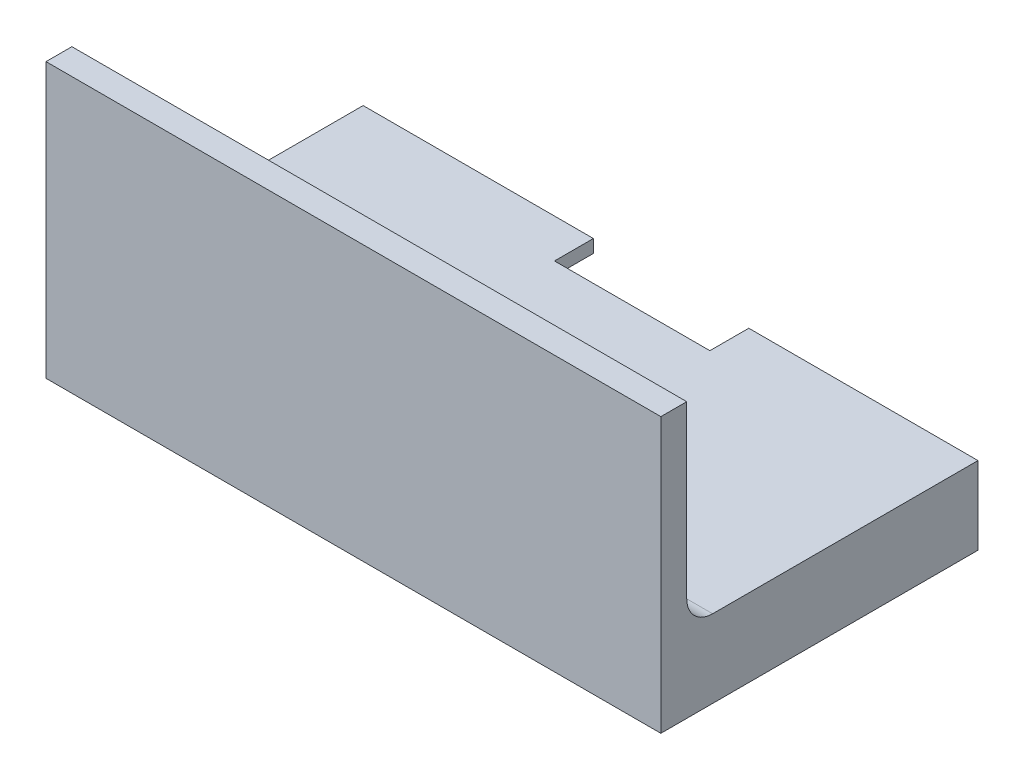
ISO-10303-21;
HEADER;
FILE_DESCRIPTION(('STEP AP214'),'2;1');
FILE_NAME('part.step','',(''),(''),'','','');
FILE_SCHEMA(('AUTOMOTIVE_DESIGN { 1 0 10303 214 1 1 1 1 }'));
ENDSEC;
DATA;
#1=APPLICATION_CONTEXT('core data for automotive mechanical design processes');
#2=APPLICATION_PROTOCOL_DEFINITION('international standard','automotive_design',2000,#1);
#3=PRODUCT_CONTEXT('',#1,'mechanical');
#4=PRODUCT('Part','Part','',(#3));
#5=PRODUCT_RELATED_PRODUCT_CATEGORY('part','',(#4));
#6=PRODUCT_DEFINITION_FORMATION('','',#4);
#7=PRODUCT_DEFINITION_CONTEXT('part definition',#1,'design');
#8=PRODUCT_DEFINITION('design','',#6,#7);
#9=PRODUCT_DEFINITION_SHAPE('','',#8);
#10=(LENGTH_UNIT() NAMED_UNIT(*) SI_UNIT(.MILLI.,.METRE.));
#11=(NAMED_UNIT(*) PLANE_ANGLE_UNIT() SI_UNIT($,.RADIAN.));
#12=(NAMED_UNIT(*) SI_UNIT($,.STERADIAN.) SOLID_ANGLE_UNIT());
#13=UNCERTAINTY_MEASURE_WITH_UNIT(LENGTH_MEASURE(1.E-05),#10,'distance_accuracy_value','');
#14=(GEOMETRIC_REPRESENTATION_CONTEXT(3) GLOBAL_UNCERTAINTY_ASSIGNED_CONTEXT((#13)) GLOBAL_UNIT_ASSIGNED_CONTEXT((#10,
#11,#12)) REPRESENTATION_CONTEXT('',''));
#15=CARTESIAN_POINT('',(0.,0.,0.));
#16=DIRECTION('',(0.,0.,1.));
#17=DIRECTION('',(1.,0.,0.));
#18=AXIS2_PLACEMENT_3D('',#15,#16,#17);
#19=CARTESIAN_POINT('',(-79.8619125241838,8.,13.7648006214418));
#20=DIRECTION('',(-1.,0.,0.));
#21=DIRECTION('',(0.,0.,1.));
#22=AXIS2_PLACEMENT_3D('',#19,#20,#21);
#23=CYLINDRICAL_SURFACE('',#22,2.);
#24=DIRECTION('',(-1.,0.,0.));
#25=VECTOR('',#24,1.);
#26=CARTESIAN_POINT('',(-79.8619125241838,8.,15.7648006214418));
#27=LINE('',#26,#25);
#28=CARTESIAN_POINT('',(-32.3619125241838,8.,15.7648006214418));
#29=VERTEX_POINT('',#28);
#30=CARTESIAN_POINT('',(-79.8619125241838,8.,15.7648006214418));
#31=VERTEX_POINT('',#30);
#32=EDGE_CURVE('E360',#29,#31,#27,.T.);
#33=ORIENTED_EDGE('',*,*,#32,.F.);
#34=CARTESIAN_POINT('',(-32.3619125241838,8.,13.7648006214418));
#35=DIRECTION('',(-1.,0.,0.));
#36=DIRECTION('',(0.,0.,1.));
#37=AXIS2_PLACEMENT_3D('',#34,#35,#36);
#38=CIRCLE('',#37,2.);
#39=CARTESIAN_POINT('',(-32.3619125241838,6.,13.7648006214417));
#40=VERTEX_POINT('',#39);
#41=EDGE_CURVE('E68',#29,#40,#38,.F.);
#42=ORIENTED_EDGE('',*,*,#41,.T.);
#43=DIRECTION('',(-1.,0.,0.));
#44=VECTOR('',#43,1.);
#45=CARTESIAN_POINT('',(0.,6.,13.7648006214418));
#46=LINE('',#45,#44);
#47=CARTESIAN_POINT('',(-79.8619125241838,6.,13.7648006214417));
#48=VERTEX_POINT('',#47);
#49=EDGE_CURVE('E364',#48,#40,#46,.F.);
#50=ORIENTED_EDGE('',*,*,#49,.F.);
#51=CARTESIAN_POINT('',(-79.8619125241838,8.,13.7648006214418));
#52=DIRECTION('',(1.,0.,0.));
#53=DIRECTION('',(0.,0.,-1.));
#54=AXIS2_PLACEMENT_3D('',#51,#52,#53);
#55=CIRCLE('',#54,2.);
#56=EDGE_CURVE('E53',#48,#31,#55,.F.);
#57=ORIENTED_EDGE('',*,*,#56,.T.);
#58=EDGE_LOOP('',(#33,#42,#50,#57));
#59=FACE_BOUND('',#58,.T.);
#60=ADVANCED_FACE('F45',(#59),#23,.F.);
#61=CARTESIAN_POINT('',(-79.8619125241838,6.,-6.73519937855824));
#62=DIRECTION('',(0.,0.,1.));
#63=DIRECTION('',(1.,0.,0.));
#64=AXIS2_PLACEMENT_3D('',#61,#62,#63);
#65=PLANE('',#64);
#66=DIRECTION('',(-1.,0.,0.));
#67=VECTOR('',#66,1.);
#68=CARTESIAN_POINT('',(-79.8619125241838,0.,-6.73519937855824));
#69=LINE('',#68,#67);
#70=CARTESIAN_POINT('',(-32.3619125241838,0.,-6.73519937855824));
#71=VERTEX_POINT('',#70);
#72=CARTESIAN_POINT('',(-34.3619125241838,0.,-6.73519937855824));
#73=VERTEX_POINT('',#72);
#74=EDGE_CURVE('E336',#71,#73,#69,.T.);
#75=ORIENTED_EDGE('',*,*,#74,.T.);
#76=DIRECTION('',(0.,-1.,0.));
#77=VECTOR('',#76,1.);
#78=CARTESIAN_POINT('',(-34.3619125241838,1.,-6.73519937855824));
#79=LINE('',#78,#77);
#80=CARTESIAN_POINT('',(-34.3619125241838,1.,-6.73519937855824));
#81=VERTEX_POINT('',#80);
#82=EDGE_CURVE('E181',#81,#73,#79,.T.);
#83=ORIENTED_EDGE('',*,*,#82,.F.);
#84=DIRECTION('',(1.,0.,0.));
#85=VECTOR('',#84,1.);
#86=CARTESIAN_POINT('',(-78.8619125241838,1.,-6.73519937855824));
#87=LINE('',#86,#85);
#88=CARTESIAN_POINT('',(-33.3619125241838,1.,-6.73519937855824));
#89=VERTEX_POINT('',#88);
#90=EDGE_CURVE('E244',#81,#89,#87,.T.);
#91=ORIENTED_EDGE('',*,*,#90,.T.);
#92=DIRECTION('',(0.,1.,0.));
#93=VECTOR('',#92,1.);
#94=CARTESIAN_POINT('',(-33.3619125241838,1.,-6.73519937855824));
#95=LINE('',#94,#93);
#96=CARTESIAN_POINT('',(-33.3619125241838,5.,-6.73519937855824));
#97=VERTEX_POINT('',#96);
#98=EDGE_CURVE('E240',#89,#97,#95,.T.);
#99=ORIENTED_EDGE('',*,*,#98,.T.);
#100=DIRECTION('',(1.,0.,0.));
#101=VECTOR('',#100,1.);
#102=CARTESIAN_POINT('',(-78.8619125241838,5.,-6.73519937855824));
#103=LINE('',#102,#101);
#104=CARTESIAN_POINT('',(-50.0697466994081,5.,-6.73519937855824));
#105=VERTEX_POINT('',#104);
#106=EDGE_CURVE('E214',#105,#97,#103,.T.);
#107=ORIENTED_EDGE('',*,*,#106,.F.);
#108=DIRECTION('',(0.,1.,0.));
#109=VECTOR('',#108,1.);
#110=CARTESIAN_POINT('',(-50.0697466994081,-4.,-6.73519937855824));
#111=LINE('',#110,#109);
#112=CARTESIAN_POINT('',(-50.0697466994081,6.,-6.73519937855824));
#113=VERTEX_POINT('',#112);
#114=EDGE_CURVE('E326',#105,#113,#111,.T.);
#115=ORIENTED_EDGE('',*,*,#114,.T.);
#116=DIRECTION('',(-1.,0.,0.));
#117=VECTOR('',#116,1.);
#118=CARTESIAN_POINT('',(-79.8619125241838,6.,-6.73519937855824));
#119=LINE('',#118,#117);
#120=CARTESIAN_POINT('',(-32.3619125241838,6.,-6.73519937855824));
#121=VERTEX_POINT('',#120);
#122=EDGE_CURVE('E340',#121,#113,#119,.T.);
#123=ORIENTED_EDGE('',*,*,#122,.F.);
#124=DIRECTION('',(0.,-1.,0.));
#125=VECTOR('',#124,1.);
#126=CARTESIAN_POINT('',(-32.3619125241838,6.,-6.73519937855824));
#127=LINE('',#126,#125);
#128=EDGE_CURVE('E356',#121,#71,#127,.T.);
#129=ORIENTED_EDGE('',*,*,#128,.T.);
#130=EDGE_LOOP('',(#75,#83,#91,#99,#107,#115,#123,#129));
#131=FACE_BOUND('',#130,.T.);
#132=ADVANCED_FACE('F399',(#131),#65,.F.);
#133=CARTESIAN_POINT('',(-79.8619125241838,6.,-6.73519937855824));
#134=DIRECTION('',(1.,0.,0.));
#135=DIRECTION('',(0.,0.,-1.));
#136=AXIS2_PLACEMENT_3D('',#133,#134,#135);
#137=PLANE('',#136);
#138=DIRECTION('',(0.,0.,1.));
#139=VECTOR('',#138,1.);
#140=CARTESIAN_POINT('',(-79.8619125241838,0.,-6.73519937855824));
#141=LINE('',#140,#139);
#142=CARTESIAN_POINT('',(-79.8619125241838,0.,-6.73519937855824));
#143=VERTEX_POINT('',#142);
#144=CARTESIAN_POINT('',(-79.8619125241838,0.,17.7648006214418));
#145=VERTEX_POINT('',#144);
#146=EDGE_CURVE('E322',#143,#145,#141,.T.);
#147=ORIENTED_EDGE('',*,*,#146,.T.);
#148=DIRECTION('',(0.,-1.,0.));
#149=VECTOR('',#148,1.);
#150=CARTESIAN_POINT('',(-79.8619125241838,21.1900753357362,17.7648006214418));
#151=LINE('',#150,#149);
#152=CARTESIAN_POINT('',(-79.8619125241838,21.1900753357362,17.7648006214418));
#153=VERTEX_POINT('',#152);
#154=EDGE_CURVE('E302',#153,#145,#151,.T.);
#155=ORIENTED_EDGE('',*,*,#154,.F.);
#156=DIRECTION('',(0.,0.,1.));
#157=VECTOR('',#156,1.);
#158=CARTESIAN_POINT('',(-79.8619125241838,21.1900753357362,15.7648006214418));
#159=LINE('',#158,#157);
#160=CARTESIAN_POINT('',(-79.8619125241838,21.1900753357362,15.7648006214418));
#161=VERTEX_POINT('',#160);
#162=EDGE_CURVE('E274',#161,#153,#159,.T.);
#163=ORIENTED_EDGE('',*,*,#162,.F.);
#164=DIRECTION('',(0.,-1.,0.));
#165=VECTOR('',#164,1.);
#166=CARTESIAN_POINT('',(-79.8619125241838,21.1900753357362,15.7648006214418));
#167=LINE('',#166,#165);
#168=EDGE_CURVE('E287',#161,#31,#167,.T.);
#169=ORIENTED_EDGE('',*,*,#168,.T.);
#170=ORIENTED_EDGE('',*,*,#56,.F.);
#171=DIRECTION('',(0.,0.,1.));
#172=VECTOR('',#171,1.);
#173=CARTESIAN_POINT('',(-79.8619125241838,6.,-6.73519937855824));
#174=LINE('',#173,#172);
#175=CARTESIAN_POINT('',(-79.8619125241838,6.,-6.73519937855824));
#176=VERTEX_POINT('',#175);
#177=EDGE_CURVE('E331',#176,#48,#174,.T.);
#178=ORIENTED_EDGE('',*,*,#177,.F.);
#179=DIRECTION('',(0.,-1.,0.));
#180=VECTOR('',#179,1.);
#181=CARTESIAN_POINT('',(-79.8619125241838,6.,-6.73519937855824));
#182=LINE('',#181,#180);
#183=EDGE_CURVE('E344',#176,#143,#182,.T.);
#184=ORIENTED_EDGE('',*,*,#183,.T.);
#185=EDGE_LOOP('',(#147,#155,#163,#169,#170,#178,#184));
#186=FACE_BOUND('',#185,.T.);
#187=ADVANCED_FACE('F377',(#186),#137,.F.);
#188=CARTESIAN_POINT('',(-32.3619125241838,6.,-6.73519937855824));
#189=DIRECTION('',(-1.,0.,0.));
#190=DIRECTION('',(0.,0.,1.));
#191=AXIS2_PLACEMENT_3D('',#188,#189,#190);
#192=PLANE('',#191);
#193=DIRECTION('',(0.,0.,-1.));
#194=VECTOR('',#193,1.);
#195=CARTESIAN_POINT('',(-32.3619125241838,0.,-6.73519937855824));
#196=LINE('',#195,#194);
#197=CARTESIAN_POINT('',(-32.3619125241838,0.,17.7648006214418));
#198=VERTEX_POINT('',#197);
#199=EDGE_CURVE('E347',#198,#71,#196,.T.);
#200=ORIENTED_EDGE('',*,*,#199,.T.);
#201=ORIENTED_EDGE('',*,*,#128,.F.);
#202=DIRECTION('',(0.,0.,-1.));
#203=VECTOR('',#202,1.);
#204=CARTESIAN_POINT('',(-32.3619125241838,6.,-6.73519937855824));
#205=LINE('',#204,#203);
#206=EDGE_CURVE('E335',#40,#121,#205,.T.);
#207=ORIENTED_EDGE('',*,*,#206,.F.);
#208=ORIENTED_EDGE('',*,*,#41,.F.);
#209=DIRECTION('',(0.,-1.,0.));
#210=VECTOR('',#209,1.);
#211=CARTESIAN_POINT('',(-32.3619125241838,21.1900753357362,15.7648006214418));
#212=LINE('',#211,#210);
#213=CARTESIAN_POINT('',(-32.3619125241838,21.1900753357362,15.7648006214418));
#214=VERTEX_POINT('',#213);
#215=EDGE_CURVE('E294',#214,#29,#212,.T.);
#216=ORIENTED_EDGE('',*,*,#215,.F.);
#217=DIRECTION('',(0.,0.,-1.));
#218=VECTOR('',#217,1.);
#219=CARTESIAN_POINT('',(-32.3619125241838,21.1900753357362,15.7648006214418));
#220=LINE('',#219,#218);
#221=CARTESIAN_POINT('',(-32.3619125241838,21.1900753357362,17.7648006214418));
#222=VERTEX_POINT('',#221);
#223=EDGE_CURVE('E281',#222,#214,#220,.T.);
#224=ORIENTED_EDGE('',*,*,#223,.F.);
#225=DIRECTION('',(0.,-1.,0.));
#226=VECTOR('',#225,1.);
#227=CARTESIAN_POINT('',(-32.3619125241838,21.1900753357362,17.7648006214418));
#228=LINE('',#227,#226);
#229=EDGE_CURVE('E298',#222,#198,#228,.T.);
#230=ORIENTED_EDGE('',*,*,#229,.T.);
#231=EDGE_LOOP('',(#200,#201,#207,#208,#216,#224,#230));
#232=FACE_BOUND('',#231,.T.);
#233=ADVANCED_FACE('F384',(#232),#192,.F.);
#234=CARTESIAN_POINT('',(-78.8619125241838,1.,-6.73519937855824));
#235=VERTEX_POINT('',#234);
#236=CARTESIAN_POINT('',(-77.8619125241838,1.,-6.73519937855824));
#237=VERTEX_POINT('',#236);
#238=EDGE_CURVE('E245',#235,#237,#87,.T.);
#239=ORIENTED_EDGE('',*,*,#238,.T.);
#240=DIRECTION('',(0.,1.,0.));
#241=VECTOR('',#240,1.);
#242=CARTESIAN_POINT('',(-77.8619125241838,1.,-6.73519937855824));
#243=LINE('',#242,#241);
#244=CARTESIAN_POINT('',(-77.8619125241838,0.,-6.73519937855824));
#245=VERTEX_POINT('',#244);
#246=EDGE_CURVE('E196',#245,#237,#243,.T.);
#247=ORIENTED_EDGE('',*,*,#246,.F.);
#248=EDGE_CURVE('E350',#245,#143,#69,.T.);
#249=ORIENTED_EDGE('',*,*,#248,.T.);
#250=ORIENTED_EDGE('',*,*,#183,.F.);
#251=CARTESIAN_POINT('',(-62.0739323200493,6.,-6.73519937855824));
#252=VERTEX_POINT('',#251);
#253=EDGE_CURVE('E339',#252,#176,#119,.T.);
#254=ORIENTED_EDGE('',*,*,#253,.F.);
#255=DIRECTION('',(0.,1.,0.));
#256=VECTOR('',#255,1.);
#257=CARTESIAN_POINT('',(-62.0739323200493,-4.,-6.73519937855824));
#258=LINE('',#257,#256);
#259=CARTESIAN_POINT('',(-62.0739323200493,5.,-6.73519937855824));
#260=VERTEX_POINT('',#259);
#261=EDGE_CURVE('E323',#260,#252,#258,.T.);
#262=ORIENTED_EDGE('',*,*,#261,.F.);
#263=CARTESIAN_POINT('',(-78.8619125241838,5.,-6.73519937855824));
#264=VERTEX_POINT('',#263);
#265=EDGE_CURVE('E237',#264,#260,#103,.T.);
#266=ORIENTED_EDGE('',*,*,#265,.F.);
#267=DIRECTION('',(0.,1.,0.));
#268=VECTOR('',#267,1.);
#269=CARTESIAN_POINT('',(-78.8619125241838,1.,-6.73519937855824));
#270=LINE('',#269,#268);
#271=EDGE_CURVE('E226',#235,#264,#270,.T.);
#272=ORIENTED_EDGE('',*,*,#271,.F.);
#273=EDGE_LOOP('',(#239,#247,#249,#250,#254,#262,#266,#272));
#274=FACE_BOUND('',#273,.T.);
#275=ADVANCED_FACE('F415',(#274),#65,.F.);
#276=CARTESIAN_POINT('',(0.,6.,0.));
#277=DIRECTION('',(0.,1.,0.));
#278=DIRECTION('',(0.,0.,1.));
#279=AXIS2_PLACEMENT_3D('',#276,#277,#278);
#280=PLANE('',#279);
#281=ORIENTED_EDGE('',*,*,#177,.T.);
#282=ORIENTED_EDGE('',*,*,#49,.T.);
#283=ORIENTED_EDGE('',*,*,#206,.T.);
#284=ORIENTED_EDGE('',*,*,#122,.T.);
#285=DIRECTION('',(0.,0.,1.));
#286=VECTOR('',#285,1.);
#287=CARTESIAN_POINT('',(-50.0697466994081,6.,-6.73519937855824));
#288=LINE('',#287,#286);
#289=CARTESIAN_POINT('',(-50.0697466994081,6.,-3.73031583067593));
#290=VERTEX_POINT('',#289);
#291=EDGE_CURVE('E310',#113,#290,#288,.T.);
#292=ORIENTED_EDGE('',*,*,#291,.T.);
#293=DIRECTION('',(1.,0.,0.));
#294=VECTOR('',#293,1.);
#295=CARTESIAN_POINT('',(-62.0739323200493,6.,-3.73031583067593));
#296=LINE('',#295,#294);
#297=CARTESIAN_POINT('',(-62.0739323200493,6.,-3.73031583067593));
#298=VERTEX_POINT('',#297);
#299=EDGE_CURVE('E306',#298,#290,#296,.T.);
#300=ORIENTED_EDGE('',*,*,#299,.F.);
#301=DIRECTION('',(0.,0.,1.));
#302=VECTOR('',#301,1.);
#303=CARTESIAN_POINT('',(-62.0739323200493,6.,-6.73519937855824));
#304=LINE('',#303,#302);
#305=EDGE_CURVE('E314',#252,#298,#304,.T.);
#306=ORIENTED_EDGE('',*,*,#305,.F.);
#307=ORIENTED_EDGE('',*,*,#253,.T.);
#308=EDGE_LOOP('',(#281,#282,#283,#284,#292,#300,#306,#307));
#309=FACE_BOUND('',#308,.T.);
#310=ADVANCED_FACE('F389',(#309),#280,.T.);
#311=CARTESIAN_POINT('',(0.,0.,0.));
#312=DIRECTION('',(0.,1.,0.));
#313=DIRECTION('',(0.,0.,1.));
#314=AXIS2_PLACEMENT_3D('',#311,#312,#313);
#315=PLANE('',#314);
#316=DIRECTION('',(-1.,0.,0.));
#317=VECTOR('',#316,1.);
#318=CARTESIAN_POINT('',(-34.3619125241838,0.,13.2648006214418));
#319=LINE('',#318,#317);
#320=CARTESIAN_POINT('',(-34.3619125241838,0.,13.2648006214418));
#321=VERTEX_POINT('',#320);
#322=CARTESIAN_POINT('',(-77.8619125241838,0.,13.2648006214418));
#323=VERTEX_POINT('',#322);
#324=EDGE_CURVE('E191',#321,#323,#319,.T.);
#325=ORIENTED_EDGE('',*,*,#324,.F.);
#326=DIRECTION('',(0.,0.,-1.));
#327=VECTOR('',#326,1.);
#328=CARTESIAN_POINT('',(-34.3619125241838,0.,13.2648006214418));
#329=LINE('',#328,#327);
#330=EDGE_CURVE('E176',#321,#73,#329,.T.);
#331=ORIENTED_EDGE('',*,*,#330,.T.);
#332=ORIENTED_EDGE('',*,*,#74,.F.);
#333=ORIENTED_EDGE('',*,*,#199,.F.);
#334=DIRECTION('',(1.,0.,0.));
#335=VECTOR('',#334,1.);
#336=CARTESIAN_POINT('',(-79.8619125241838,0.,17.7648006214418));
#337=LINE('',#336,#335);
#338=EDGE_CURVE('E273',#145,#198,#337,.T.);
#339=ORIENTED_EDGE('',*,*,#338,.F.);
#340=ORIENTED_EDGE('',*,*,#146,.F.);
#341=ORIENTED_EDGE('',*,*,#248,.F.);
#342=DIRECTION('',(0.,0.,-1.));
#343=VECTOR('',#342,1.);
#344=CARTESIAN_POINT('',(-77.8619125241838,0.,13.2648006214418));
#345=LINE('',#344,#343);
#346=EDGE_CURVE('E187',#323,#245,#345,.T.);
#347=ORIENTED_EDGE('',*,*,#346,.F.);
#348=EDGE_LOOP('',(#325,#331,#332,#333,#339,#340,#341,#347));
#349=FACE_BOUND('',#348,.T.);
#350=ADVANCED_FACE('F198',(#349),#315,.F.);
#351=CARTESIAN_POINT('',(-62.0739323200493,-4.,-3.73031583067593));
#352=DIRECTION('',(0.,0.,1.));
#353=DIRECTION('',(1.,0.,0.));
#354=AXIS2_PLACEMENT_3D('',#351,#352,#353);
#355=PLANE('',#354);
#356=DIRECTION('',(0.,1.,0.));
#357=VECTOR('',#356,1.);
#358=CARTESIAN_POINT('',(-50.0697466994081,-4.,-3.73031583067593));
#359=LINE('',#358,#357);
#360=CARTESIAN_POINT('',(-50.0697466994081,5.,-3.73031583067593));
#361=VERTEX_POINT('',#360);
#362=EDGE_CURVE('E318',#361,#290,#359,.T.);
#363=ORIENTED_EDGE('',*,*,#362,.F.);
#364=DIRECTION('',(-1.,0.,0.));
#365=VECTOR('',#364,1.);
#366=CARTESIAN_POINT('',(-62.0739323200493,5.,-3.73031583067593));
#367=LINE('',#366,#365);
#368=CARTESIAN_POINT('',(-62.0739323200493,5.,-3.73031583067593));
#369=VERTEX_POINT('',#368);
#370=EDGE_CURVE('E255',#361,#369,#367,.T.);
#371=ORIENTED_EDGE('',*,*,#370,.T.);
#372=DIRECTION('',(0.,1.,0.));
#373=VECTOR('',#372,1.);
#374=CARTESIAN_POINT('',(-62.0739323200493,-4.,-3.73031583067593));
#375=LINE('',#374,#373);
#376=EDGE_CURVE('E319',#369,#298,#375,.T.);
#377=ORIENTED_EDGE('',*,*,#376,.T.);
#378=ORIENTED_EDGE('',*,*,#299,.T.);
#379=EDGE_LOOP('',(#363,#371,#377,#378));
#380=FACE_BOUND('',#379,.T.);
#381=ADVANCED_FACE('F409',(#380),#355,.F.);
#382=CARTESIAN_POINT('',(-62.0739323200493,-4.,-6.73519937855824));
#383=DIRECTION('',(-1.,0.,0.));
#384=DIRECTION('',(0.,0.,1.));
#385=AXIS2_PLACEMENT_3D('',#382,#383,#384);
#386=PLANE('',#385);
#387=ORIENTED_EDGE('',*,*,#376,.F.);
#388=DIRECTION('',(0.,0.,-1.));
#389=VECTOR('',#388,1.);
#390=CARTESIAN_POINT('',(-62.0739323200493,5.,-6.73519937855824));
#391=LINE('',#390,#389);
#392=EDGE_CURVE('E269',#369,#260,#391,.T.);
#393=ORIENTED_EDGE('',*,*,#392,.T.);
#394=ORIENTED_EDGE('',*,*,#261,.T.);
#395=ORIENTED_EDGE('',*,*,#305,.T.);
#396=EDGE_LOOP('',(#387,#393,#394,#395));
#397=FACE_BOUND('',#396,.T.);
#398=ADVANCED_FACE('F412',(#397),#386,.F.);
#399=CARTESIAN_POINT('',(-50.0697466994081,-4.,-6.73519937855824));
#400=DIRECTION('',(-1.,0.,0.));
#401=DIRECTION('',(0.,0.,1.));
#402=AXIS2_PLACEMENT_3D('',#399,#400,#401);
#403=PLANE('',#402);
#404=DIRECTION('',(0.,0.,-1.));
#405=VECTOR('',#404,1.);
#406=CARTESIAN_POINT('',(-50.0697466994081,5.,-6.73519937855824));
#407=LINE('',#406,#405);
#408=EDGE_CURVE('E11',#361,#105,#407,.T.);
#409=ORIENTED_EDGE('',*,*,#408,.F.);
#410=ORIENTED_EDGE('',*,*,#362,.T.);
#411=ORIENTED_EDGE('',*,*,#291,.F.);
#412=ORIENTED_EDGE('',*,*,#114,.F.);
#413=EDGE_LOOP('',(#409,#410,#411,#412));
#414=FACE_BOUND('',#413,.T.);
#415=ADVANCED_FACE('F405',(#414),#403,.T.);
#416=CARTESIAN_POINT('',(-79.8619125241838,21.1900753357362,17.7648006214418));
#417=DIRECTION('',(0.,0.,-1.));
#418=DIRECTION('',(-1.,0.,0.));
#419=AXIS2_PLACEMENT_3D('',#416,#417,#418);
#420=PLANE('',#419);
#421=ORIENTED_EDGE('',*,*,#338,.T.);
#422=ORIENTED_EDGE('',*,*,#229,.F.);
#423=DIRECTION('',(1.,0.,0.));
#424=VECTOR('',#423,1.);
#425=CARTESIAN_POINT('',(-79.8619125241838,21.1900753357362,17.7648006214418));
#426=LINE('',#425,#424);
#427=EDGE_CURVE('E278',#153,#222,#426,.T.);
#428=ORIENTED_EDGE('',*,*,#427,.F.);
#429=ORIENTED_EDGE('',*,*,#154,.T.);
#430=EDGE_LOOP('',(#421,#422,#428,#429));
#431=FACE_BOUND('',#430,.T.);
#432=ADVANCED_FACE('F397',(#431),#420,.F.);
#433=CARTESIAN_POINT('',(-79.8619125241838,21.1900753357362,15.7648006214418));
#434=DIRECTION('',(0.,0.,1.));
#435=DIRECTION('',(1.,0.,0.));
#436=AXIS2_PLACEMENT_3D('',#433,#434,#435);
#437=PLANE('',#436);
#438=ORIENTED_EDGE('',*,*,#215,.T.);
#439=ORIENTED_EDGE('',*,*,#32,.T.);
#440=ORIENTED_EDGE('',*,*,#168,.F.);
#441=DIRECTION('',(-1.,0.,0.));
#442=VECTOR('',#441,1.);
#443=CARTESIAN_POINT('',(-79.8619125241838,21.1900753357362,15.7648006214418));
#444=LINE('',#443,#442);
#445=EDGE_CURVE('E284',#214,#161,#444,.T.);
#446=ORIENTED_EDGE('',*,*,#445,.F.);
#447=EDGE_LOOP('',(#438,#439,#440,#446));
#448=FACE_BOUND('',#447,.T.);
#449=ADVANCED_FACE('F373',(#448),#437,.F.);
#450=CARTESIAN_POINT('',(0.,21.1900753357362,0.));
#451=DIRECTION('',(0.,1.,0.));
#452=DIRECTION('',(0.,0.,1.));
#453=AXIS2_PLACEMENT_3D('',#450,#451,#452);
#454=PLANE('',#453);
#455=ORIENTED_EDGE('',*,*,#162,.T.);
#456=ORIENTED_EDGE('',*,*,#427,.T.);
#457=ORIENTED_EDGE('',*,*,#223,.T.);
#458=ORIENTED_EDGE('',*,*,#445,.T.);
#459=EDGE_LOOP('',(#455,#456,#457,#458));
#460=FACE_BOUND('',#459,.T.);
#461=ADVANCED_FACE('F380',(#460),#454,.T.);
#462=CARTESIAN_POINT('',(-78.8619125241838,5.,13.7648006214418));
#463=DIRECTION('',(0.,1.,0.));
#464=DIRECTION('',(0.,0.,1.));
#465=AXIS2_PLACEMENT_3D('',#462,#463,#464);
#466=PLANE('',#465);
#467=ORIENTED_EDGE('',*,*,#370,.F.);
#468=ORIENTED_EDGE('',*,*,#408,.T.);
#469=ORIENTED_EDGE('',*,*,#106,.T.);
#470=DIRECTION('',(0.,0.,-1.));
#471=VECTOR('',#470,1.);
#472=CARTESIAN_POINT('',(-33.3619125241838,5.,13.7648006214418));
#473=LINE('',#472,#471);
#474=CARTESIAN_POINT('',(-33.3619125241838,5.,13.7648006214418));
#475=VERTEX_POINT('',#474);
#476=EDGE_CURVE('E236',#475,#97,#473,.T.);
#477=ORIENTED_EDGE('',*,*,#476,.F.);
#478=DIRECTION('',(1.,0.,0.));
#479=VECTOR('',#478,1.);
#480=CARTESIAN_POINT('',(-78.8619125241838,5.,13.7648006214418));
#481=LINE('',#480,#479);
#482=CARTESIAN_POINT('',(-78.8619125241838,5.,13.7648006214418));
#483=VERTEX_POINT('',#482);
#484=EDGE_CURVE('E221',#483,#475,#481,.T.);
#485=ORIENTED_EDGE('',*,*,#484,.F.);
#486=DIRECTION('',(0.,0.,-1.));
#487=VECTOR('',#486,1.);
#488=CARTESIAN_POINT('',(-78.8619125241838,5.,13.7648006214418));
#489=LINE('',#488,#487);
#490=EDGE_CURVE('E252',#483,#264,#489,.T.);
#491=ORIENTED_EDGE('',*,*,#490,.T.);
#492=ORIENTED_EDGE('',*,*,#265,.T.);
#493=ORIENTED_EDGE('',*,*,#392,.F.);
#494=EDGE_LOOP('',(#467,#468,#469,#477,#485,#491,#492,#493));
#495=FACE_BOUND('',#494,.T.);
#496=ADVANCED_FACE('F423',(#495),#466,.F.);
#497=CARTESIAN_POINT('',(-78.8619125241838,1.,13.7648006214418));
#498=DIRECTION('',(0.,1.,0.));
#499=DIRECTION('',(-1.,0.,0.));
#500=AXIS2_PLACEMENT_3D('',#497,#498,#499);
#501=PLANE('',#500);
#502=DIRECTION('',(0.,0.,-1.));
#503=VECTOR('',#502,1.);
#504=CARTESIAN_POINT('',(-34.3619125241838,1.,13.2648006214418));
#505=LINE('',#504,#503);
#506=CARTESIAN_POINT('',(-34.3619125241838,1.,13.2648006214418));
#507=VERTEX_POINT('',#506);
#508=EDGE_CURVE('E211',#507,#81,#505,.T.);
#509=ORIENTED_EDGE('',*,*,#508,.F.);
#510=DIRECTION('',(1.,0.,0.));
#511=VECTOR('',#510,1.);
#512=CARTESIAN_POINT('',(-34.3619125241838,1.,13.2648006214418));
#513=LINE('',#512,#511);
#514=CARTESIAN_POINT('',(-77.8619125241838,1.,13.2648006214418));
#515=VERTEX_POINT('',#514);
#516=EDGE_CURVE('E188',#515,#507,#513,.T.);
#517=ORIENTED_EDGE('',*,*,#516,.F.);
#518=DIRECTION('',(0.,0.,-1.));
#519=VECTOR('',#518,1.);
#520=CARTESIAN_POINT('',(-77.8619125241838,1.,13.2648006214418));
#521=LINE('',#520,#519);
#522=EDGE_CURVE('E215',#515,#237,#521,.T.);
#523=ORIENTED_EDGE('',*,*,#522,.T.);
#524=ORIENTED_EDGE('',*,*,#238,.F.);
#525=DIRECTION('',(0.,0.,-1.));
#526=VECTOR('',#525,1.);
#527=CARTESIAN_POINT('',(-78.8619125241838,1.,13.7648006214418));
#528=LINE('',#527,#526);
#529=CARTESIAN_POINT('',(-78.8619125241838,1.,13.7648006214418));
#530=VERTEX_POINT('',#529);
#531=EDGE_CURVE('E256',#530,#235,#528,.T.);
#532=ORIENTED_EDGE('',*,*,#531,.F.);
#533=DIRECTION('',(1.,0.,0.));
#534=VECTOR('',#533,1.);
#535=CARTESIAN_POINT('',(-78.8619125241838,1.,13.7648006214418));
#536=LINE('',#535,#534);
#537=CARTESIAN_POINT('',(-33.3619125241838,1.,13.7648006214418));
#538=VERTEX_POINT('',#537);
#539=EDGE_CURVE('E229',#530,#538,#536,.T.);
#540=ORIENTED_EDGE('',*,*,#539,.T.);
#541=DIRECTION('',(0.,0.,-1.));
#542=VECTOR('',#541,1.);
#543=CARTESIAN_POINT('',(-33.3619125241838,1.,13.7648006214418));
#544=LINE('',#543,#542);
#545=EDGE_CURVE('E259',#538,#89,#544,.T.);
#546=ORIENTED_EDGE('',*,*,#545,.T.);
#547=ORIENTED_EDGE('',*,*,#90,.F.);
#548=EDGE_LOOP('',(#509,#517,#523,#524,#532,#540,#546,#547));
#549=FACE_BOUND('',#548,.T.);
#550=ADVANCED_FACE('F432',(#549),#501,.T.);
#551=CARTESIAN_POINT('',(-78.8619125241838,1.,13.7648006214418));
#552=DIRECTION('',(-1.,0.,0.));
#553=DIRECTION('',(0.,0.,1.));
#554=AXIS2_PLACEMENT_3D('',#551,#552,#553);
#555=PLANE('',#554);
#556=ORIENTED_EDGE('',*,*,#271,.T.);
#557=ORIENTED_EDGE('',*,*,#490,.F.);
#558=DIRECTION('',(0.,1.,0.));
#559=VECTOR('',#558,1.);
#560=CARTESIAN_POINT('',(-78.8619125241838,1.,13.7648006214418));
#561=LINE('',#560,#559);
#562=EDGE_CURVE('E232',#530,#483,#561,.T.);
#563=ORIENTED_EDGE('',*,*,#562,.F.);
#564=ORIENTED_EDGE('',*,*,#531,.T.);
#565=EDGE_LOOP('',(#556,#557,#563,#564));
#566=FACE_BOUND('',#565,.T.);
#567=ADVANCED_FACE('F438',(#566),#555,.F.);
#568=CARTESIAN_POINT('',(-33.3619125241838,1.,13.7648006214418));
#569=DIRECTION('',(-1.,0.,0.));
#570=DIRECTION('',(0.,0.,1.));
#571=AXIS2_PLACEMENT_3D('',#568,#569,#570);
#572=PLANE('',#571);
#573=ORIENTED_EDGE('',*,*,#98,.F.);
#574=ORIENTED_EDGE('',*,*,#545,.F.);
#575=DIRECTION('',(0.,1.,0.));
#576=VECTOR('',#575,1.);
#577=CARTESIAN_POINT('',(-33.3619125241838,1.,13.7648006214418));
#578=LINE('',#577,#576);
#579=EDGE_CURVE('E225',#538,#475,#578,.T.);
#580=ORIENTED_EDGE('',*,*,#579,.T.);
#581=ORIENTED_EDGE('',*,*,#476,.T.);
#582=EDGE_LOOP('',(#573,#574,#580,#581));
#583=FACE_BOUND('',#582,.T.);
#584=ADVANCED_FACE('F427',(#583),#572,.T.);
#585=CARTESIAN_POINT('',(0.,0.,13.7648006214418));
#586=DIRECTION('',(0.,0.,1.));
#587=DIRECTION('',(1.,0.,0.));
#588=AXIS2_PLACEMENT_3D('',#585,#586,#587);
#589=PLANE('',#588);
#590=ORIENTED_EDGE('',*,*,#484,.T.);
#591=ORIENTED_EDGE('',*,*,#579,.F.);
#592=ORIENTED_EDGE('',*,*,#539,.F.);
#593=ORIENTED_EDGE('',*,*,#562,.T.);
#594=EDGE_LOOP('',(#590,#591,#592,#593));
#595=FACE_BOUND('',#594,.T.);
#596=ADVANCED_FACE('F435',(#595),#589,.F.);
#597=CARTESIAN_POINT('',(-34.3619125241838,1.,13.2648006214418));
#598=DIRECTION('',(1.,0.,0.));
#599=DIRECTION('',(0.,0.,-1.));
#600=AXIS2_PLACEMENT_3D('',#597,#598,#599);
#601=PLANE('',#600);
#602=ORIENTED_EDGE('',*,*,#82,.T.);
#603=ORIENTED_EDGE('',*,*,#330,.F.);
#604=DIRECTION('',(0.,-1.,0.));
#605=VECTOR('',#604,1.);
#606=CARTESIAN_POINT('',(-34.3619125241838,1.,13.2648006214418));
#607=LINE('',#606,#605);
#608=EDGE_CURVE('E179',#507,#321,#607,.T.);
#609=ORIENTED_EDGE('',*,*,#608,.F.);
#610=ORIENTED_EDGE('',*,*,#508,.T.);
#611=EDGE_LOOP('',(#602,#603,#609,#610));
#612=FACE_BOUND('',#611,.T.);
#613=ADVANCED_FACE('F178',(#612),#601,.F.);
#614=CARTESIAN_POINT('',(-77.8619125241838,1.,13.2648006214418));
#615=DIRECTION('',(-1.,0.,0.));
#616=DIRECTION('',(0.,0.,1.));
#617=AXIS2_PLACEMENT_3D('',#614,#615,#616);
#618=PLANE('',#617);
#619=ORIENTED_EDGE('',*,*,#246,.T.);
#620=ORIENTED_EDGE('',*,*,#522,.F.);
#621=DIRECTION('',(0.,1.,0.));
#622=VECTOR('',#621,1.);
#623=CARTESIAN_POINT('',(-77.8619125241838,1.,13.2648006214418));
#624=LINE('',#623,#622);
#625=EDGE_CURVE('E60',#323,#515,#624,.T.);
#626=ORIENTED_EDGE('',*,*,#625,.F.);
#627=ORIENTED_EDGE('',*,*,#346,.T.);
#628=EDGE_LOOP('',(#619,#620,#626,#627));
#629=FACE_BOUND('',#628,.T.);
#630=ADVANCED_FACE('F442',(#629),#618,.F.);
#631=CARTESIAN_POINT('',(0.,0.,13.2648006214418));
#632=DIRECTION('',(0.,0.,-1.));
#633=DIRECTION('',(-1.,0.,0.));
#634=AXIS2_PLACEMENT_3D('',#631,#632,#633);
#635=PLANE('',#634);
#636=ORIENTED_EDGE('',*,*,#608,.T.);
#637=ORIENTED_EDGE('',*,*,#324,.T.);
#638=ORIENTED_EDGE('',*,*,#625,.T.);
#639=ORIENTED_EDGE('',*,*,#516,.T.);
#640=EDGE_LOOP('',(#636,#637,#638,#639));
#641=FACE_BOUND('',#640,.T.);
#642=ADVANCED_FACE('F190',(#641),#635,.T.);
#643=CLOSED_SHELL('',(#60,#132,#187,#233,#275,#310,#350,#381,#398,#415,#432,#449,#461,#496,#550,
#567,#584,#596,#613,#630,#642));
#644=MANIFOLD_SOLID_BREP('B2',#643);
#645=ADVANCED_BREP_SHAPE_REPRESENTATION('',(#18,#644),#14);
#646=SHAPE_DEFINITION_REPRESENTATION(#9,#645);
ENDSEC;
END-ISO-10303-21;
